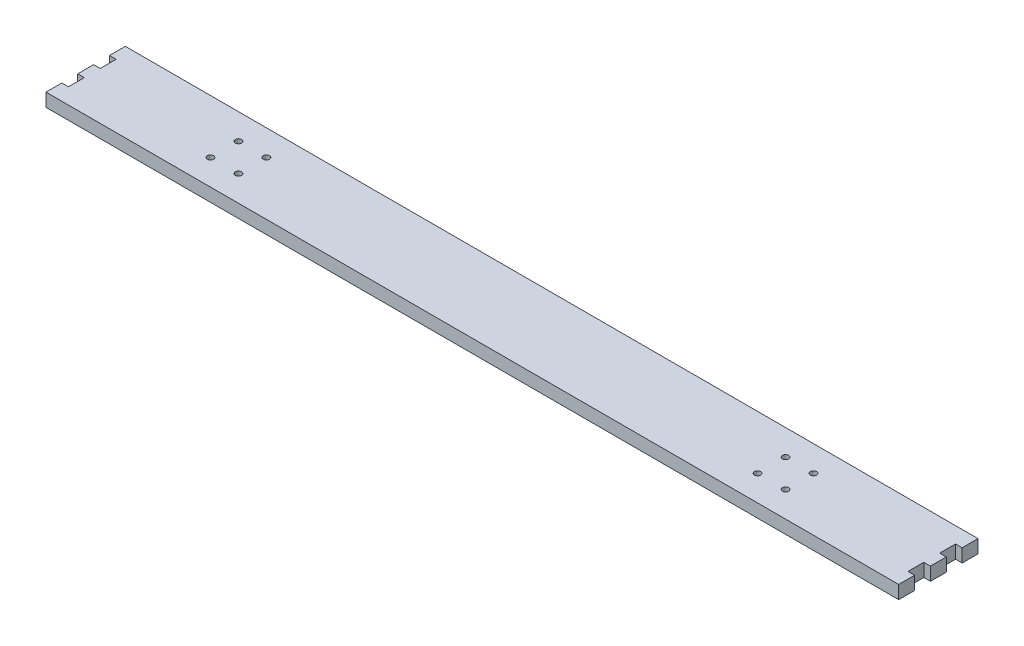
ISO-10303-21;
HEADER;
FILE_DESCRIPTION(('STEP AP214'),'2;1');
FILE_NAME('part.step','',(''),(''),'','','');
FILE_SCHEMA(('AUTOMOTIVE_DESIGN { 1 0 10303 214 1 1 1 1 }'));
ENDSEC;
DATA;
#1=APPLICATION_CONTEXT('core data for automotive mechanical design processes');
#2=APPLICATION_PROTOCOL_DEFINITION('international standard','automotive_design',2000,#1);
#3=PRODUCT_CONTEXT('',#1,'mechanical');
#4=PRODUCT('Part','Part','',(#3));
#5=PRODUCT_RELATED_PRODUCT_CATEGORY('part','',(#4));
#6=PRODUCT_DEFINITION_FORMATION('','',#4);
#7=PRODUCT_DEFINITION_CONTEXT('part definition',#1,'design');
#8=PRODUCT_DEFINITION('design','',#6,#7);
#9=PRODUCT_DEFINITION_SHAPE('','',#8);
#10=(LENGTH_UNIT() NAMED_UNIT(*) SI_UNIT(.MILLI.,.METRE.));
#11=(NAMED_UNIT(*) PLANE_ANGLE_UNIT() SI_UNIT($,.RADIAN.));
#12=(NAMED_UNIT(*) SI_UNIT($,.STERADIAN.) SOLID_ANGLE_UNIT());
#13=UNCERTAINTY_MEASURE_WITH_UNIT(LENGTH_MEASURE(1.E-05),#10,'distance_accuracy_value','');
#14=(GEOMETRIC_REPRESENTATION_CONTEXT(3) GLOBAL_UNCERTAINTY_ASSIGNED_CONTEXT((#13)) GLOBAL_UNIT_ASSIGNED_CONTEXT((#10,
#11,#12)) REPRESENTATION_CONTEXT('',''));
#15=CARTESIAN_POINT('',(0.,0.,0.));
#16=DIRECTION('',(0.,0.,1.));
#17=DIRECTION('',(1.,0.,0.));
#18=AXIS2_PLACEMENT_3D('',#15,#16,#17);
#19=CARTESIAN_POINT('',(204.7875,6.35,19.05));
#20=DIRECTION('',(-1.,0.,0.));
#21=DIRECTION('',(0.,0.,1.));
#22=AXIS2_PLACEMENT_3D('',#19,#20,#21);
#23=PLANE('',#22);
#24=DIRECTION('',(0.,1.,0.));
#25=VECTOR('',#24,1.);
#26=CARTESIAN_POINT('',(204.7875,-0.00100000000000013,-3.81));
#27=LINE('',#26,#25);
#28=CARTESIAN_POINT('',(204.7875,0.,-3.81));
#29=VERTEX_POINT('',#28);
#30=CARTESIAN_POINT('',(204.7875,6.35,-3.81));
#31=VERTEX_POINT('',#30);
#32=EDGE_CURVE('E178',#29,#31,#27,.T.);
#33=ORIENTED_EDGE('',*,*,#32,.T.);
#34=DIRECTION('',(0.,0.,-1.));
#35=VECTOR('',#34,1.);
#36=CARTESIAN_POINT('',(204.7875,6.35,19.05));
#37=LINE('',#36,#35);
#38=CARTESIAN_POINT('',(204.7875,6.35,3.81));
#39=VERTEX_POINT('',#38);
#40=EDGE_CURVE('E285',#39,#31,#37,.T.);
#41=ORIENTED_EDGE('',*,*,#40,.F.);
#42=DIRECTION('',(0.,1.,0.));
#43=VECTOR('',#42,1.);
#44=CARTESIAN_POINT('',(204.7875,-0.00100000000000013,3.81));
#45=LINE('',#44,#43);
#46=CARTESIAN_POINT('',(204.7875,0.,3.81));
#47=VERTEX_POINT('',#46);
#48=EDGE_CURVE('E304',#47,#39,#45,.T.);
#49=ORIENTED_EDGE('',*,*,#48,.F.);
#50=DIRECTION('',(0.,0.,-1.));
#51=VECTOR('',#50,1.);
#52=CARTESIAN_POINT('',(204.7875,0.,19.05));
#53=LINE('',#52,#51);
#54=EDGE_CURVE('E192',#47,#29,#53,.T.);
#55=ORIENTED_EDGE('',*,*,#54,.T.);
#56=EDGE_LOOP('',(#33,#41,#49,#55));
#57=FACE_BOUND('',#56,.T.);
#58=ADVANCED_FACE('F33',(#57),#23,.F.);
#59=DIRECTION('',(0.,1.,0.));
#60=VECTOR('',#59,1.);
#61=CARTESIAN_POINT('',(204.7875,-0.00100000000000013,-11.43));
#62=LINE('',#61,#60);
#63=CARTESIAN_POINT('',(204.7875,0.,-11.43));
#64=VERTEX_POINT('',#63);
#65=CARTESIAN_POINT('',(204.7875,6.35,-11.43));
#66=VERTEX_POINT('',#65);
#67=EDGE_CURVE('E172',#64,#66,#62,.T.);
#68=ORIENTED_EDGE('',*,*,#67,.F.);
#69=CARTESIAN_POINT('',(204.7875,0.,-19.05));
#70=VERTEX_POINT('',#69);
#71=EDGE_CURVE('E184',#64,#70,#53,.T.);
#72=ORIENTED_EDGE('',*,*,#71,.T.);
#73=DIRECTION('',(0.,-1.,0.));
#74=VECTOR('',#73,1.);
#75=CARTESIAN_POINT('',(204.7875,6.35,-19.05));
#76=LINE('',#75,#74);
#77=CARTESIAN_POINT('',(204.7875,6.35,-19.05));
#78=VERTEX_POINT('',#77);
#79=EDGE_CURVE('E11',#78,#70,#76,.T.);
#80=ORIENTED_EDGE('',*,*,#79,.F.);
#81=EDGE_CURVE('E186',#66,#78,#37,.T.);
#82=ORIENTED_EDGE('',*,*,#81,.F.);
#83=EDGE_LOOP('',(#68,#72,#80,#82));
#84=FACE_BOUND('',#83,.T.);
#85=ADVANCED_FACE('F182',(#84),#23,.F.);
#86=DIRECTION('',(0.,1.,0.));
#87=VECTOR('',#86,1.);
#88=CARTESIAN_POINT('',(204.7875,-0.00100000000000013,11.43));
#89=LINE('',#88,#87);
#90=CARTESIAN_POINT('',(204.7875,0.,11.43));
#91=VERTEX_POINT('',#90);
#92=CARTESIAN_POINT('',(204.7875,6.35,11.43));
#93=VERTEX_POINT('',#92);
#94=EDGE_CURVE('E303',#91,#93,#89,.T.);
#95=ORIENTED_EDGE('',*,*,#94,.T.);
#96=CARTESIAN_POINT('',(204.7875,6.35,19.05));
#97=VERTEX_POINT('',#96);
#98=EDGE_CURVE('E281',#97,#93,#37,.T.);
#99=ORIENTED_EDGE('',*,*,#98,.F.);
#100=DIRECTION('',(0.,-1.,0.));
#101=VECTOR('',#100,1.);
#102=CARTESIAN_POINT('',(204.7875,6.35,19.05));
#103=LINE('',#102,#101);
#104=CARTESIAN_POINT('',(204.7875,0.,19.05));
#105=VERTEX_POINT('',#104);
#106=EDGE_CURVE('E218',#97,#105,#103,.T.);
#107=ORIENTED_EDGE('',*,*,#106,.T.);
#108=EDGE_CURVE('E195',#105,#91,#53,.T.);
#109=ORIENTED_EDGE('',*,*,#108,.T.);
#110=EDGE_LOOP('',(#95,#99,#107,#109));
#111=FACE_BOUND('',#110,.T.);
#112=ADVANCED_FACE('F302',(#111),#23,.F.);
#113=CARTESIAN_POINT('',(0.,6.35,0.));
#114=DIRECTION('',(0.,-1.,0.));
#115=DIRECTION('',(0.,0.,-1.));
#116=AXIS2_PLACEMENT_3D('',#113,#114,#115);
#117=PLANE('',#116);
#118=CARTESIAN_POINT('',(138.1125,6.35,6.71751442127221));
#119=DIRECTION('',(0.,-1.,0.));
#120=DIRECTION('',(0.,0.,1.));
#121=AXIS2_PLACEMENT_3D('',#118,#119,#120);
#122=CIRCLE('',#121,1.5);
#123=CARTESIAN_POINT('',(138.1125,6.35,8.21751442127221));
#124=VERTEX_POINT('',#123);
#125=EDGE_CURVE('E589',#124,#124,#122,.T.);
#126=ORIENTED_EDGE('',*,*,#125,.T.);
#127=EDGE_LOOP('',(#126));
#128=FACE_BOUND('',#127,.T.);
#129=CARTESIAN_POINT('',(124.677471157456,6.35,-6.7175144212722));
#130=DIRECTION('',(0.,-1.,0.));
#131=DIRECTION('',(0.,0.,1.));
#132=AXIS2_PLACEMENT_3D('',#129,#130,#131);
#133=CIRCLE('',#132,1.5);
#134=CARTESIAN_POINT('',(124.677471157456,6.35,-5.21751442127221));
#135=VERTEX_POINT('',#134);
#136=EDGE_CURVE('E595',#135,#135,#133,.T.);
#137=ORIENTED_EDGE('',*,*,#136,.T.);
#138=EDGE_LOOP('',(#137));
#139=FACE_BOUND('',#138,.T.);
#140=CARTESIAN_POINT('',(124.677471157456,6.35,6.7175144212722));
#141=DIRECTION('',(0.,-1.,0.));
#142=DIRECTION('',(0.,0.,1.));
#143=AXIS2_PLACEMENT_3D('',#140,#141,#142);
#144=CIRCLE('',#143,1.5);
#145=CARTESIAN_POINT('',(124.677471157456,6.35,8.2175144212722));
#146=VERTEX_POINT('',#145);
#147=EDGE_CURVE('E654',#146,#146,#144,.T.);
#148=ORIENTED_EDGE('',*,*,#147,.T.);
#149=EDGE_LOOP('',(#148));
#150=FACE_BOUND('',#149,.T.);
#151=CARTESIAN_POINT('',(138.1125,6.35,-6.71751442127219));
#152=DIRECTION('',(0.,-1.,0.));
#153=DIRECTION('',(0.,0.,1.));
#154=AXIS2_PLACEMENT_3D('',#151,#152,#153);
#155=CIRCLE('',#154,1.5);
#156=CARTESIAN_POINT('',(138.1125,6.35,-5.2175144212722));
#157=VERTEX_POINT('',#156);
#158=EDGE_CURVE('E592',#157,#157,#155,.T.);
#159=ORIENTED_EDGE('',*,*,#158,.T.);
#160=EDGE_LOOP('',(#159));
#161=FACE_BOUND('',#160,.T.);
#162=CARTESIAN_POINT('',(-138.1125,6.35,6.71751442127221));
#163=DIRECTION('',(0.,1.,0.));
#164=DIRECTION('',(0.,0.,1.));
#165=AXIS2_PLACEMENT_3D('',#162,#163,#164);
#166=CIRCLE('',#165,1.5);
#167=CARTESIAN_POINT('',(-138.1125,6.35,8.21751442127221));
#168=VERTEX_POINT('',#167);
#169=EDGE_CURVE('E615',#168,#168,#166,.T.);
#170=ORIENTED_EDGE('',*,*,#169,.F.);
#171=EDGE_LOOP('',(#170));
#172=FACE_BOUND('',#171,.T.);
#173=CARTESIAN_POINT('',(-124.677471157456,6.35,-6.7175144212722));
#174=DIRECTION('',(0.,1.,0.));
#175=DIRECTION('',(0.,0.,1.));
#176=AXIS2_PLACEMENT_3D('',#173,#174,#175);
#177=CIRCLE('',#176,1.5);
#178=CARTESIAN_POINT('',(-124.677471157456,6.35,-5.21751442127221));
#179=VERTEX_POINT('',#178);
#180=EDGE_CURVE('E621',#179,#179,#177,.T.);
#181=ORIENTED_EDGE('',*,*,#180,.F.);
#182=EDGE_LOOP('',(#181));
#183=FACE_BOUND('',#182,.T.);
#184=CARTESIAN_POINT('',(-124.677471157456,6.35,6.7175144212722));
#185=DIRECTION('',(0.,1.,0.));
#186=DIRECTION('',(0.,0.,1.));
#187=AXIS2_PLACEMENT_3D('',#184,#185,#186);
#188=CIRCLE('',#187,1.5);
#189=CARTESIAN_POINT('',(-124.677471157456,6.35,8.2175144212722));
#190=VERTEX_POINT('',#189);
#191=EDGE_CURVE('E609',#190,#190,#188,.T.);
#192=ORIENTED_EDGE('',*,*,#191,.F.);
#193=EDGE_LOOP('',(#192));
#194=FACE_BOUND('',#193,.T.);
#195=CARTESIAN_POINT('',(-138.1125,6.35,-6.71751442127219));
#196=DIRECTION('',(0.,1.,0.));
#197=DIRECTION('',(0.,0.,1.));
#198=AXIS2_PLACEMENT_3D('',#195,#196,#197);
#199=CIRCLE('',#198,1.5);
#200=CARTESIAN_POINT('',(-138.1125,6.35,-5.2175144212722));
#201=VERTEX_POINT('',#200);
#202=EDGE_CURVE('E339',#201,#201,#199,.T.);
#203=ORIENTED_EDGE('',*,*,#202,.F.);
#204=EDGE_LOOP('',(#203));
#205=FACE_BOUND('',#204,.T.);
#206=DIRECTION('',(-1.,0.,0.));
#207=VECTOR('',#206,1.);
#208=CARTESIAN_POINT('',(204.7875,6.35,-3.81));
#209=LINE('',#208,#207);
#210=CARTESIAN_POINT('',(201.6125,6.35,-3.81));
#211=VERTEX_POINT('',#210);
#212=EDGE_CURVE('E187',#31,#211,#209,.T.);
#213=ORIENTED_EDGE('',*,*,#212,.T.);
#214=DIRECTION('',(0.,0.,-1.));
#215=VECTOR('',#214,1.);
#216=CARTESIAN_POINT('',(201.6125,6.35,-11.43));
#217=LINE('',#216,#215);
#218=CARTESIAN_POINT('',(201.6125,6.35,-11.43));
#219=VERTEX_POINT('',#218);
#220=EDGE_CURVE('E328',#211,#219,#217,.T.);
#221=ORIENTED_EDGE('',*,*,#220,.T.);
#222=DIRECTION('',(1.,0.,0.));
#223=VECTOR('',#222,1.);
#224=CARTESIAN_POINT('',(204.7875,6.35,-11.43));
#225=LINE('',#224,#223);
#226=EDGE_CURVE('E321',#219,#66,#225,.T.);
#227=ORIENTED_EDGE('',*,*,#226,.T.);
#228=ORIENTED_EDGE('',*,*,#81,.T.);
#229=DIRECTION('',(-1.,0.,0.));
#230=VECTOR('',#229,1.);
#231=CARTESIAN_POINT('',(-204.7875,6.35,-19.05));
#232=LINE('',#231,#230);
#233=CARTESIAN_POINT('',(-204.7875,6.35,-19.05));
#234=VERTEX_POINT('',#233);
#235=EDGE_CURVE('E284',#78,#234,#232,.T.);
#236=ORIENTED_EDGE('',*,*,#235,.T.);
#237=DIRECTION('',(0.,0.,1.));
#238=VECTOR('',#237,1.);
#239=CARTESIAN_POINT('',(-204.7875,6.35,19.05));
#240=LINE('',#239,#238);
#241=CARTESIAN_POINT('',(-204.7875,6.35,-11.43));
#242=VERTEX_POINT('',#241);
#243=EDGE_CURVE('E228',#234,#242,#240,.T.);
#244=ORIENTED_EDGE('',*,*,#243,.T.);
#245=DIRECTION('',(-1.,0.,0.));
#246=VECTOR('',#245,1.);
#247=CARTESIAN_POINT('',(-204.7875,6.35,-11.43));
#248=LINE('',#247,#246);
#249=CARTESIAN_POINT('',(-201.6125,6.35,-11.43));
#250=VERTEX_POINT('',#249);
#251=EDGE_CURVE('E248',#250,#242,#248,.T.);
#252=ORIENTED_EDGE('',*,*,#251,.F.);
#253=DIRECTION('',(0.,0.,-1.));
#254=VECTOR('',#253,1.);
#255=CARTESIAN_POINT('',(-201.6125,6.35,-11.43));
#256=LINE('',#255,#254);
#257=CARTESIAN_POINT('',(-201.6125,6.35,-3.81));
#258=VERTEX_POINT('',#257);
#259=EDGE_CURVE('E240',#258,#250,#256,.T.);
#260=ORIENTED_EDGE('',*,*,#259,.F.);
#261=DIRECTION('',(1.,0.,0.));
#262=VECTOR('',#261,1.);
#263=CARTESIAN_POINT('',(-204.7875,6.35,-3.81));
#264=LINE('',#263,#262);
#265=CARTESIAN_POINT('',(-204.7875,6.35,-3.81));
#266=VERTEX_POINT('',#265);
#267=EDGE_CURVE('E237',#266,#258,#264,.T.);
#268=ORIENTED_EDGE('',*,*,#267,.F.);
#269=CARTESIAN_POINT('',(-204.7875,6.35,3.81));
#270=VERTEX_POINT('',#269);
#271=EDGE_CURVE('E288',#266,#270,#240,.T.);
#272=ORIENTED_EDGE('',*,*,#271,.T.);
#273=DIRECTION('',(-1.,0.,0.));
#274=VECTOR('',#273,1.);
#275=CARTESIAN_POINT('',(-204.7875,6.35,3.81));
#276=LINE('',#275,#274);
#277=CARTESIAN_POINT('',(-201.6125,6.35,3.81));
#278=VERTEX_POINT('',#277);
#279=EDGE_CURVE('E265',#278,#270,#276,.T.);
#280=ORIENTED_EDGE('',*,*,#279,.F.);
#281=DIRECTION('',(0.,0.,-1.));
#282=VECTOR('',#281,1.);
#283=CARTESIAN_POINT('',(-201.6125,6.35,3.81));
#284=LINE('',#283,#282);
#285=CARTESIAN_POINT('',(-201.6125,6.35,11.43));
#286=VERTEX_POINT('',#285);
#287=EDGE_CURVE('E270',#286,#278,#284,.T.);
#288=ORIENTED_EDGE('',*,*,#287,.F.);
#289=DIRECTION('',(1.,0.,0.));
#290=VECTOR('',#289,1.);
#291=CARTESIAN_POINT('',(-204.7875,6.35,11.43));
#292=LINE('',#291,#290);
#293=CARTESIAN_POINT('',(-204.7875,6.35,11.43));
#294=VERTEX_POINT('',#293);
#295=EDGE_CURVE('E267',#294,#286,#292,.T.);
#296=ORIENTED_EDGE('',*,*,#295,.F.);
#297=CARTESIAN_POINT('',(-204.7875,6.35,19.05));
#298=VERTEX_POINT('',#297);
#299=EDGE_CURVE('E287',#294,#298,#240,.T.);
#300=ORIENTED_EDGE('',*,*,#299,.T.);
#301=DIRECTION('',(1.,0.,0.));
#302=VECTOR('',#301,1.);
#303=CARTESIAN_POINT('',(-204.7875,6.35,19.05));
#304=LINE('',#303,#302);
#305=EDGE_CURVE('E221',#298,#97,#304,.T.);
#306=ORIENTED_EDGE('',*,*,#305,.T.);
#307=ORIENTED_EDGE('',*,*,#98,.T.);
#308=DIRECTION('',(-1.,0.,0.));
#309=VECTOR('',#308,1.);
#310=CARTESIAN_POINT('',(204.7875,6.35,11.43));
#311=LINE('',#310,#309);
#312=CARTESIAN_POINT('',(201.6125,6.35,11.43));
#313=VERTEX_POINT('',#312);
#314=EDGE_CURVE('E313',#93,#313,#311,.T.);
#315=ORIENTED_EDGE('',*,*,#314,.T.);
#316=DIRECTION('',(0.,0.,-1.));
#317=VECTOR('',#316,1.);
#318=CARTESIAN_POINT('',(201.6125,6.35,3.81));
#319=LINE('',#318,#317);
#320=CARTESIAN_POINT('',(201.6125,6.35,3.81));
#321=VERTEX_POINT('',#320);
#322=EDGE_CURVE('E344',#313,#321,#319,.T.);
#323=ORIENTED_EDGE('',*,*,#322,.T.);
#324=DIRECTION('',(1.,0.,0.));
#325=VECTOR('',#324,1.);
#326=CARTESIAN_POINT('',(204.7875,6.35,3.81));
#327=LINE('',#326,#325);
#328=EDGE_CURVE('E341',#321,#39,#327,.T.);
#329=ORIENTED_EDGE('',*,*,#328,.T.);
#330=ORIENTED_EDGE('',*,*,#40,.T.);
#331=EDGE_LOOP('',(#213,#221,#227,#228,#236,#244,#252,#260,#268,#272,#280,#288,#296,#300,#306,
#307,#315,#323,#329,#330));
#332=FACE_BOUND('',#331,.T.);
#333=ADVANCED_FACE('F293',(#128,#139,#150,#161,#172,#183,#194,#205,#332),#117,.F.);
#334=CARTESIAN_POINT('',(0.,0.,0.));
#335=DIRECTION('',(0.,-1.,0.));
#336=DIRECTION('',(0.,0.,-1.));
#337=AXIS2_PLACEMENT_3D('',#334,#335,#336);
#338=PLANE('',#337);
#339=CARTESIAN_POINT('',(138.1125,0.,6.71751442127221));
#340=DIRECTION('',(0.,-1.,0.));
#341=DIRECTION('',(0.,0.,-1.));
#342=AXIS2_PLACEMENT_3D('',#339,#340,#341);
#343=CIRCLE('',#342,1.5);
#344=CARTESIAN_POINT('',(138.1125,0.,5.21751442127221));
#345=VERTEX_POINT('',#344);
#346=EDGE_CURVE('E587',#345,#345,#343,.T.);
#347=ORIENTED_EDGE('',*,*,#346,.F.);
#348=EDGE_LOOP('',(#347));
#349=FACE_BOUND('',#348,.T.);
#350=CARTESIAN_POINT('',(124.677471157456,0.,-6.7175144212722));
#351=DIRECTION('',(0.,-1.,0.));
#352=DIRECTION('',(0.,0.,-1.));
#353=AXIS2_PLACEMENT_3D('',#350,#351,#352);
#354=CIRCLE('',#353,1.5);
#355=CARTESIAN_POINT('',(124.677471157456,0.,-8.2175144212722));
#356=VERTEX_POINT('',#355);
#357=EDGE_CURVE('E590',#356,#356,#354,.T.);
#358=ORIENTED_EDGE('',*,*,#357,.F.);
#359=EDGE_LOOP('',(#358));
#360=FACE_BOUND('',#359,.T.);
#361=CARTESIAN_POINT('',(124.677471157456,0.,6.7175144212722));
#362=DIRECTION('',(0.,-1.,0.));
#363=DIRECTION('',(0.,0.,-1.));
#364=AXIS2_PLACEMENT_3D('',#361,#362,#363);
#365=CIRCLE('',#364,1.5);
#366=CARTESIAN_POINT('',(124.677471157456,0.,5.21751442127221));
#367=VERTEX_POINT('',#366);
#368=EDGE_CURVE('E598',#367,#367,#365,.T.);
#369=ORIENTED_EDGE('',*,*,#368,.F.);
#370=EDGE_LOOP('',(#369));
#371=FACE_BOUND('',#370,.T.);
#372=CARTESIAN_POINT('',(138.1125,0.,-6.71751442127219));
#373=DIRECTION('',(0.,-1.,0.));
#374=DIRECTION('',(0.,0.,-1.));
#375=AXIS2_PLACEMENT_3D('',#372,#373,#374);
#376=CIRCLE('',#375,1.5);
#377=CARTESIAN_POINT('',(138.1125,0.,-8.21751442127219));
#378=VERTEX_POINT('',#377);
#379=EDGE_CURVE('E605',#378,#378,#376,.T.);
#380=ORIENTED_EDGE('',*,*,#379,.F.);
#381=EDGE_LOOP('',(#380));
#382=FACE_BOUND('',#381,.T.);
#383=CARTESIAN_POINT('',(-138.1125,0.,6.71751442127221));
#384=DIRECTION('',(0.,-1.,0.));
#385=DIRECTION('',(0.,0.,-1.));
#386=AXIS2_PLACEMENT_3D('',#383,#384,#385);
#387=CIRCLE('',#386,1.5);
#388=CARTESIAN_POINT('',(-138.1125,0.,5.21751442127221));
#389=VERTEX_POINT('',#388);
#390=EDGE_CURVE('E618',#389,#389,#387,.F.);
#391=ORIENTED_EDGE('',*,*,#390,.T.);
#392=EDGE_LOOP('',(#391));
#393=FACE_BOUND('',#392,.T.);
#394=CARTESIAN_POINT('',(-124.677471157456,0.,-6.7175144212722));
#395=DIRECTION('',(0.,-1.,0.));
#396=DIRECTION('',(0.,0.,-1.));
#397=AXIS2_PLACEMENT_3D('',#394,#395,#396);
#398=CIRCLE('',#397,1.5);
#399=CARTESIAN_POINT('',(-124.677471157456,0.,-8.2175144212722));
#400=VERTEX_POINT('',#399);
#401=EDGE_CURVE('E612',#400,#400,#398,.F.);
#402=ORIENTED_EDGE('',*,*,#401,.T.);
#403=EDGE_LOOP('',(#402));
#404=FACE_BOUND('',#403,.T.);
#405=CARTESIAN_POINT('',(-124.677471157456,0.,6.7175144212722));
#406=DIRECTION('',(0.,-1.,0.));
#407=DIRECTION('',(0.,0.,-1.));
#408=AXIS2_PLACEMENT_3D('',#405,#406,#407);
#409=CIRCLE('',#408,1.5);
#410=CARTESIAN_POINT('',(-124.677471157456,0.,5.21751442127221));
#411=VERTEX_POINT('',#410);
#412=EDGE_CURVE('E608',#411,#411,#409,.F.);
#413=ORIENTED_EDGE('',*,*,#412,.T.);
#414=EDGE_LOOP('',(#413));
#415=FACE_BOUND('',#414,.T.);
#416=CARTESIAN_POINT('',(-138.1125,0.,-6.71751442127219));
#417=DIRECTION('',(0.,-1.,0.));
#418=DIRECTION('',(0.,0.,-1.));
#419=AXIS2_PLACEMENT_3D('',#416,#417,#418);
#420=CIRCLE('',#419,1.5);
#421=CARTESIAN_POINT('',(-138.1125,0.,-8.21751442127219));
#422=VERTEX_POINT('',#421);
#423=EDGE_CURVE('E324',#422,#422,#420,.F.);
#424=ORIENTED_EDGE('',*,*,#423,.T.);
#425=EDGE_LOOP('',(#424));
#426=FACE_BOUND('',#425,.T.);
#427=DIRECTION('',(0.,0.,-1.));
#428=VECTOR('',#427,1.);
#429=CARTESIAN_POINT('',(201.6125,0.,-11.43));
#430=LINE('',#429,#428);
#431=CARTESIAN_POINT('',(201.6125,0.,-3.81));
#432=VERTEX_POINT('',#431);
#433=CARTESIAN_POINT('',(201.6125,0.,-11.43));
#434=VERTEX_POINT('',#433);
#435=EDGE_CURVE('E47',#432,#434,#430,.T.);
#436=ORIENTED_EDGE('',*,*,#435,.F.);
#437=DIRECTION('',(-1.,0.,0.));
#438=VECTOR('',#437,1.);
#439=CARTESIAN_POINT('',(204.7875,0.,-3.81));
#440=LINE('',#439,#438);
#441=EDGE_CURVE('E318',#29,#432,#440,.T.);
#442=ORIENTED_EDGE('',*,*,#441,.F.);
#443=ORIENTED_EDGE('',*,*,#54,.F.);
#444=DIRECTION('',(1.,0.,0.));
#445=VECTOR('',#444,1.);
#446=CARTESIAN_POINT('',(204.7875,0.,3.81));
#447=LINE('',#446,#445);
#448=CARTESIAN_POINT('',(201.6125,0.,3.81));
#449=VERTEX_POINT('',#448);
#450=EDGE_CURVE('E338',#449,#47,#447,.T.);
#451=ORIENTED_EDGE('',*,*,#450,.F.);
#452=DIRECTION('',(0.,0.,-1.));
#453=VECTOR('',#452,1.);
#454=CARTESIAN_POINT('',(201.6125,0.,3.81));
#455=LINE('',#454,#453);
#456=CARTESIAN_POINT('',(201.6125,0.,11.43));
#457=VERTEX_POINT('',#456);
#458=EDGE_CURVE('E307',#457,#449,#455,.T.);
#459=ORIENTED_EDGE('',*,*,#458,.F.);
#460=DIRECTION('',(-1.,0.,0.));
#461=VECTOR('',#460,1.);
#462=CARTESIAN_POINT('',(204.7875,0.,11.43));
#463=LINE('',#462,#461);
#464=EDGE_CURVE('E55',#91,#457,#463,.T.);
#465=ORIENTED_EDGE('',*,*,#464,.F.);
#466=ORIENTED_EDGE('',*,*,#108,.F.);
#467=DIRECTION('',(1.,0.,0.));
#468=VECTOR('',#467,1.);
#469=CARTESIAN_POINT('',(-204.7875,0.,19.05));
#470=LINE('',#469,#468);
#471=CARTESIAN_POINT('',(-204.7875,0.,19.05));
#472=VERTEX_POINT('',#471);
#473=EDGE_CURVE('E216',#472,#105,#470,.T.);
#474=ORIENTED_EDGE('',*,*,#473,.F.);
#475=DIRECTION('',(0.,0.,1.));
#476=VECTOR('',#475,1.);
#477=CARTESIAN_POINT('',(-204.7875,0.,19.05));
#478=LINE('',#477,#476);
#479=CARTESIAN_POINT('',(-204.7875,0.,11.43));
#480=VERTEX_POINT('',#479);
#481=EDGE_CURVE('E207',#480,#472,#478,.T.);
#482=ORIENTED_EDGE('',*,*,#481,.F.);
#483=DIRECTION('',(1.,0.,0.));
#484=VECTOR('',#483,1.);
#485=CARTESIAN_POINT('',(-204.7875,0.,11.43));
#486=LINE('',#485,#484);
#487=CARTESIAN_POINT('',(-201.6125,0.,11.43));
#488=VERTEX_POINT('',#487);
#489=EDGE_CURVE('E177',#480,#488,#486,.T.);
#490=ORIENTED_EDGE('',*,*,#489,.T.);
#491=DIRECTION('',(0.,0.,-1.));
#492=VECTOR('',#491,1.);
#493=CARTESIAN_POINT('',(-201.6125,0.,3.81));
#494=LINE('',#493,#492);
#495=CARTESIAN_POINT('',(-201.6125,0.,3.81));
#496=VERTEX_POINT('',#495);
#497=EDGE_CURVE('E259',#488,#496,#494,.T.);
#498=ORIENTED_EDGE('',*,*,#497,.T.);
#499=DIRECTION('',(-1.,0.,0.));
#500=VECTOR('',#499,1.);
#501=CARTESIAN_POINT('',(-204.7875,0.,3.81));
#502=LINE('',#501,#500);
#503=CARTESIAN_POINT('',(-204.7875,0.,3.81));
#504=VERTEX_POINT('',#503);
#505=EDGE_CURVE('E262',#496,#504,#502,.T.);
#506=ORIENTED_EDGE('',*,*,#505,.T.);
#507=CARTESIAN_POINT('',(-204.7875,0.,-3.80999999999999));
#508=VERTEX_POINT('',#507);
#509=EDGE_CURVE('E211',#508,#504,#478,.T.);
#510=ORIENTED_EDGE('',*,*,#509,.F.);
#511=DIRECTION('',(1.,0.,0.));
#512=VECTOR('',#511,1.);
#513=CARTESIAN_POINT('',(-204.7875,0.,-3.81));
#514=LINE('',#513,#512);
#515=CARTESIAN_POINT('',(-201.6125,0.,-3.81));
#516=VERTEX_POINT('',#515);
#517=EDGE_CURVE('E193',#508,#516,#514,.T.);
#518=ORIENTED_EDGE('',*,*,#517,.T.);
#519=DIRECTION('',(0.,0.,-1.));
#520=VECTOR('',#519,1.);
#521=CARTESIAN_POINT('',(-201.6125,0.,-11.43));
#522=LINE('',#521,#520);
#523=CARTESIAN_POINT('',(-201.6125,0.,-11.43));
#524=VERTEX_POINT('',#523);
#525=EDGE_CURVE('E234',#516,#524,#522,.T.);
#526=ORIENTED_EDGE('',*,*,#525,.T.);
#527=DIRECTION('',(-1.,0.,0.));
#528=VECTOR('',#527,1.);
#529=CARTESIAN_POINT('',(-204.7875,0.,-11.43));
#530=LINE('',#529,#528);
#531=CARTESIAN_POINT('',(-204.7875,0.,-11.43));
#532=VERTEX_POINT('',#531);
#533=EDGE_CURVE('E232',#524,#532,#530,.T.);
#534=ORIENTED_EDGE('',*,*,#533,.T.);
#535=CARTESIAN_POINT('',(-204.7875,0.,-19.05));
#536=VERTEX_POINT('',#535);
#537=EDGE_CURVE('E213',#536,#532,#478,.T.);
#538=ORIENTED_EDGE('',*,*,#537,.F.);
#539=DIRECTION('',(-1.,0.,0.));
#540=VECTOR('',#539,1.);
#541=CARTESIAN_POINT('',(-204.7875,0.,-19.05));
#542=LINE('',#541,#540);
#543=EDGE_CURVE('E191',#70,#536,#542,.T.);
#544=ORIENTED_EDGE('',*,*,#543,.F.);
#545=ORIENTED_EDGE('',*,*,#71,.F.);
#546=DIRECTION('',(1.,0.,0.));
#547=VECTOR('',#546,1.);
#548=CARTESIAN_POINT('',(204.7875,0.,-11.43));
#549=LINE('',#548,#547);
#550=EDGE_CURVE('E168',#434,#64,#549,.T.);
#551=ORIENTED_EDGE('',*,*,#550,.F.);
#552=EDGE_LOOP('',(#436,#442,#443,#451,#459,#465,#466,#474,#482,#490,#498,#506,#510,#518,#526,
#534,#538,#544,#545,#551));
#553=FACE_BOUND('',#552,.T.);
#554=ADVANCED_FACE('F189',(#349,#360,#371,#382,#393,#404,#415,#426,#553),#338,.T.);
#555=CARTESIAN_POINT('',(-204.7875,6.35,19.05));
#556=DIRECTION('',(1.,0.,0.));
#557=DIRECTION('',(0.,0.,-1.));
#558=AXIS2_PLACEMENT_3D('',#555,#556,#557);
#559=PLANE('',#558);
#560=ORIENTED_EDGE('',*,*,#537,.T.);
#561=DIRECTION('',(0.,1.,0.));
#562=VECTOR('',#561,1.);
#563=CARTESIAN_POINT('',(-204.7875,-0.00100000000000013,-11.43));
#564=LINE('',#563,#562);
#565=EDGE_CURVE('E198',#532,#242,#564,.T.);
#566=ORIENTED_EDGE('',*,*,#565,.T.);
#567=ORIENTED_EDGE('',*,*,#243,.F.);
#568=DIRECTION('',(0.,-1.,0.));
#569=VECTOR('',#568,1.);
#570=CARTESIAN_POINT('',(-204.7875,6.35,-19.05));
#571=LINE('',#570,#569);
#572=EDGE_CURVE('E40',#234,#536,#571,.T.);
#573=ORIENTED_EDGE('',*,*,#572,.T.);
#574=EDGE_LOOP('',(#560,#566,#567,#573));
#575=FACE_BOUND('',#574,.T.);
#576=ADVANCED_FACE('F225',(#575),#559,.F.);
#577=ORIENTED_EDGE('',*,*,#271,.F.);
#578=DIRECTION('',(0.,1.,0.));
#579=VECTOR('',#578,1.);
#580=CARTESIAN_POINT('',(-204.7875,-0.00100000000000013,-3.81));
#581=LINE('',#580,#579);
#582=EDGE_CURVE('E250',#508,#266,#581,.T.);
#583=ORIENTED_EDGE('',*,*,#582,.F.);
#584=ORIENTED_EDGE('',*,*,#509,.T.);
#585=DIRECTION('',(0.,1.,0.));
#586=VECTOR('',#585,1.);
#587=CARTESIAN_POINT('',(-204.7875,-0.00100000000000013,3.81));
#588=LINE('',#587,#586);
#589=EDGE_CURVE('E273',#504,#270,#588,.T.);
#590=ORIENTED_EDGE('',*,*,#589,.T.);
#591=EDGE_LOOP('',(#577,#583,#584,#590));
#592=FACE_BOUND('',#591,.T.);
#593=ADVANCED_FACE('F360',(#592),#559,.F.);
#594=CARTESIAN_POINT('',(-204.7875,6.35,-19.05));
#595=DIRECTION('',(0.,0.,1.));
#596=DIRECTION('',(1.,0.,0.));
#597=AXIS2_PLACEMENT_3D('',#594,#595,#596);
#598=PLANE('',#597);
#599=ORIENTED_EDGE('',*,*,#543,.T.);
#600=ORIENTED_EDGE('',*,*,#572,.F.);
#601=ORIENTED_EDGE('',*,*,#235,.F.);
#602=ORIENTED_EDGE('',*,*,#79,.T.);
#603=EDGE_LOOP('',(#599,#600,#601,#602));
#604=FACE_BOUND('',#603,.T.);
#605=ADVANCED_FACE('F357',(#604),#598,.F.);
#606=ORIENTED_EDGE('',*,*,#299,.F.);
#607=DIRECTION('',(0.,1.,0.));
#608=VECTOR('',#607,1.);
#609=CARTESIAN_POINT('',(-204.7875,-0.00100000000000013,11.43));
#610=LINE('',#609,#608);
#611=EDGE_CURVE('E277',#480,#294,#610,.T.);
#612=ORIENTED_EDGE('',*,*,#611,.F.);
#613=ORIENTED_EDGE('',*,*,#481,.T.);
#614=DIRECTION('',(0.,-1.,0.));
#615=VECTOR('',#614,1.);
#616=CARTESIAN_POINT('',(-204.7875,6.35,19.05));
#617=LINE('',#616,#615);
#618=EDGE_CURVE('E220',#298,#472,#617,.T.);
#619=ORIENTED_EDGE('',*,*,#618,.F.);
#620=EDGE_LOOP('',(#606,#612,#613,#619));
#621=FACE_BOUND('',#620,.T.);
#622=ADVANCED_FACE('F359',(#621),#559,.F.);
#623=CARTESIAN_POINT('',(-204.7875,6.35,19.05));
#624=DIRECTION('',(0.,0.,-1.));
#625=DIRECTION('',(-1.,0.,0.));
#626=AXIS2_PLACEMENT_3D('',#623,#624,#625);
#627=PLANE('',#626);
#628=ORIENTED_EDGE('',*,*,#473,.T.);
#629=ORIENTED_EDGE('',*,*,#106,.F.);
#630=ORIENTED_EDGE('',*,*,#305,.F.);
#631=ORIENTED_EDGE('',*,*,#618,.T.);
#632=EDGE_LOOP('',(#628,#629,#630,#631));
#633=FACE_BOUND('',#632,.T.);
#634=ADVANCED_FACE('F300',(#633),#627,.F.);
#635=CARTESIAN_POINT('',(-204.7875,-0.00100000000000013,3.81));
#636=DIRECTION('',(0.,0.,-1.));
#637=DIRECTION('',(-1.,0.,0.));
#638=AXIS2_PLACEMENT_3D('',#635,#636,#637);
#639=PLANE('',#638);
#640=DIRECTION('',(0.,1.,0.));
#641=VECTOR('',#640,1.);
#642=CARTESIAN_POINT('',(-201.6125,-0.00100000000000013,3.81));
#643=LINE('',#642,#641);
#644=EDGE_CURVE('E242',#496,#278,#643,.T.);
#645=ORIENTED_EDGE('',*,*,#644,.T.);
#646=ORIENTED_EDGE('',*,*,#279,.T.);
#647=ORIENTED_EDGE('',*,*,#589,.F.);
#648=ORIENTED_EDGE('',*,*,#505,.F.);
#649=EDGE_LOOP('',(#645,#646,#647,#648));
#650=FACE_BOUND('',#649,.T.);
#651=ADVANCED_FACE('F386',(#650),#639,.F.);
#652=CARTESIAN_POINT('',(-201.6125,-0.00100000000000013,3.81));
#653=DIRECTION('',(1.,0.,0.));
#654=DIRECTION('',(0.,0.,-1.));
#655=AXIS2_PLACEMENT_3D('',#652,#653,#654);
#656=PLANE('',#655);
#657=DIRECTION('',(0.,1.,0.));
#658=VECTOR('',#657,1.);
#659=CARTESIAN_POINT('',(-201.6125,-0.00100000000000013,11.43));
#660=LINE('',#659,#658);
#661=EDGE_CURVE('E275',#488,#286,#660,.T.);
#662=ORIENTED_EDGE('',*,*,#661,.T.);
#663=ORIENTED_EDGE('',*,*,#287,.T.);
#664=ORIENTED_EDGE('',*,*,#644,.F.);
#665=ORIENTED_EDGE('',*,*,#497,.F.);
#666=EDGE_LOOP('',(#662,#663,#664,#665));
#667=FACE_BOUND('',#666,.T.);
#668=ADVANCED_FACE('F393',(#667),#656,.F.);
#669=CARTESIAN_POINT('',(-204.7875,-0.00100000000000013,11.43));
#670=DIRECTION('',(0.,0.,1.));
#671=DIRECTION('',(1.,0.,0.));
#672=AXIS2_PLACEMENT_3D('',#669,#670,#671);
#673=PLANE('',#672);
#674=ORIENTED_EDGE('',*,*,#611,.T.);
#675=ORIENTED_EDGE('',*,*,#295,.T.);
#676=ORIENTED_EDGE('',*,*,#661,.F.);
#677=ORIENTED_EDGE('',*,*,#489,.F.);
#678=EDGE_LOOP('',(#674,#675,#676,#677));
#679=FACE_BOUND('',#678,.T.);
#680=ADVANCED_FACE('F398',(#679),#673,.F.);
#681=CARTESIAN_POINT('',(-204.7875,-0.00100000000000013,-11.43));
#682=DIRECTION('',(0.,0.,-1.));
#683=DIRECTION('',(-1.,0.,0.));
#684=AXIS2_PLACEMENT_3D('',#681,#682,#683);
#685=PLANE('',#684);
#686=DIRECTION('',(0.,1.,0.));
#687=VECTOR('',#686,1.);
#688=CARTESIAN_POINT('',(-201.6125,-0.00100000000000013,-11.43));
#689=LINE('',#688,#687);
#690=EDGE_CURVE('E252',#524,#250,#689,.T.);
#691=ORIENTED_EDGE('',*,*,#690,.T.);
#692=ORIENTED_EDGE('',*,*,#251,.T.);
#693=ORIENTED_EDGE('',*,*,#565,.F.);
#694=ORIENTED_EDGE('',*,*,#533,.F.);
#695=EDGE_LOOP('',(#691,#692,#693,#694));
#696=FACE_BOUND('',#695,.T.);
#697=ADVANCED_FACE('F438',(#696),#685,.F.);
#698=CARTESIAN_POINT('',(-201.6125,-0.00100000000000013,-11.43));
#699=DIRECTION('',(1.,0.,0.));
#700=DIRECTION('',(0.,0.,-1.));
#701=AXIS2_PLACEMENT_3D('',#698,#699,#700);
#702=PLANE('',#701);
#703=DIRECTION('',(0.,1.,0.));
#704=VECTOR('',#703,1.);
#705=CARTESIAN_POINT('',(-201.6125,-0.00100000000000013,-3.81));
#706=LINE('',#705,#704);
#707=EDGE_CURVE('E254',#516,#258,#706,.T.);
#708=ORIENTED_EDGE('',*,*,#707,.T.);
#709=ORIENTED_EDGE('',*,*,#259,.T.);
#710=ORIENTED_EDGE('',*,*,#690,.F.);
#711=ORIENTED_EDGE('',*,*,#525,.F.);
#712=EDGE_LOOP('',(#708,#709,#710,#711));
#713=FACE_BOUND('',#712,.T.);
#714=ADVANCED_FACE('F441',(#713),#702,.F.);
#715=CARTESIAN_POINT('',(-204.7875,-0.00100000000000013,-3.81));
#716=DIRECTION('',(0.,0.,1.));
#717=DIRECTION('',(1.,0.,0.));
#718=AXIS2_PLACEMENT_3D('',#715,#716,#717);
#719=PLANE('',#718);
#720=ORIENTED_EDGE('',*,*,#582,.T.);
#721=ORIENTED_EDGE('',*,*,#267,.T.);
#722=ORIENTED_EDGE('',*,*,#707,.F.);
#723=ORIENTED_EDGE('',*,*,#517,.F.);
#724=EDGE_LOOP('',(#720,#721,#722,#723));
#725=FACE_BOUND('',#724,.T.);
#726=ADVANCED_FACE('F437',(#725),#719,.F.);
#727=CARTESIAN_POINT('',(204.7875,-0.00100000000000013,3.81));
#728=DIRECTION('',(0.,0.,1.));
#729=DIRECTION('',(1.,0.,0.));
#730=AXIS2_PLACEMENT_3D('',#727,#728,#729);
#731=PLANE('',#730);
#732=ORIENTED_EDGE('',*,*,#450,.T.);
#733=ORIENTED_EDGE('',*,*,#48,.T.);
#734=ORIENTED_EDGE('',*,*,#328,.F.);
#735=DIRECTION('',(0.,1.,0.));
#736=VECTOR('',#735,1.);
#737=CARTESIAN_POINT('',(201.6125,-0.00100000000000013,3.81));
#738=LINE('',#737,#736);
#739=EDGE_CURVE('E309',#449,#321,#738,.T.);
#740=ORIENTED_EDGE('',*,*,#739,.F.);
#741=EDGE_LOOP('',(#732,#733,#734,#740));
#742=FACE_BOUND('',#741,.T.);
#743=ADVANCED_FACE('F351',(#742),#731,.T.);
#744=CARTESIAN_POINT('',(204.7875,-0.00100000000000013,11.43));
#745=DIRECTION('',(0.,0.,-1.));
#746=DIRECTION('',(-1.,0.,0.));
#747=AXIS2_PLACEMENT_3D('',#744,#745,#746);
#748=PLANE('',#747);
#749=ORIENTED_EDGE('',*,*,#464,.T.);
#750=DIRECTION('',(0.,1.,0.));
#751=VECTOR('',#750,1.);
#752=CARTESIAN_POINT('',(201.6125,-0.00100000000000013,11.43));
#753=LINE('',#752,#751);
#754=EDGE_CURVE('E305',#457,#313,#753,.T.);
#755=ORIENTED_EDGE('',*,*,#754,.T.);
#756=ORIENTED_EDGE('',*,*,#314,.F.);
#757=ORIENTED_EDGE('',*,*,#94,.F.);
#758=EDGE_LOOP('',(#749,#755,#756,#757));
#759=FACE_BOUND('',#758,.T.);
#760=ADVANCED_FACE('F347',(#759),#748,.T.);
#761=CARTESIAN_POINT('',(201.6125,-0.00100000000000013,3.81));
#762=DIRECTION('',(1.,0.,0.));
#763=DIRECTION('',(0.,0.,-1.));
#764=AXIS2_PLACEMENT_3D('',#761,#762,#763);
#765=PLANE('',#764);
#766=ORIENTED_EDGE('',*,*,#458,.T.);
#767=ORIENTED_EDGE('',*,*,#739,.T.);
#768=ORIENTED_EDGE('',*,*,#322,.F.);
#769=ORIENTED_EDGE('',*,*,#754,.F.);
#770=EDGE_LOOP('',(#766,#767,#768,#769));
#771=FACE_BOUND('',#770,.T.);
#772=ADVANCED_FACE('F348',(#771),#765,.T.);
#773=CARTESIAN_POINT('',(204.7875,-0.00100000000000013,-3.81));
#774=DIRECTION('',(0.,0.,-1.));
#775=DIRECTION('',(-1.,0.,0.));
#776=AXIS2_PLACEMENT_3D('',#773,#774,#775);
#777=PLANE('',#776);
#778=ORIENTED_EDGE('',*,*,#441,.T.);
#779=DIRECTION('',(0.,1.,0.));
#780=VECTOR('',#779,1.);
#781=CARTESIAN_POINT('',(201.6125,-0.00100000000000013,-3.81));
#782=LINE('',#781,#780);
#783=EDGE_CURVE('E334',#432,#211,#782,.T.);
#784=ORIENTED_EDGE('',*,*,#783,.T.);
#785=ORIENTED_EDGE('',*,*,#212,.F.);
#786=ORIENTED_EDGE('',*,*,#32,.F.);
#787=EDGE_LOOP('',(#778,#784,#785,#786));
#788=FACE_BOUND('',#787,.T.);
#789=ADVANCED_FACE('F417',(#788),#777,.T.);
#790=CARTESIAN_POINT('',(201.6125,-0.00100000000000013,-11.43));
#791=DIRECTION('',(1.,0.,0.));
#792=DIRECTION('',(0.,0.,-1.));
#793=AXIS2_PLACEMENT_3D('',#790,#791,#792);
#794=PLANE('',#793);
#795=ORIENTED_EDGE('',*,*,#435,.T.);
#796=DIRECTION('',(0.,1.,0.));
#797=VECTOR('',#796,1.);
#798=CARTESIAN_POINT('',(201.6125,-0.00100000000000013,-11.43));
#799=LINE('',#798,#797);
#800=EDGE_CURVE('E174',#434,#219,#799,.T.);
#801=ORIENTED_EDGE('',*,*,#800,.T.);
#802=ORIENTED_EDGE('',*,*,#220,.F.);
#803=ORIENTED_EDGE('',*,*,#783,.F.);
#804=EDGE_LOOP('',(#795,#801,#802,#803));
#805=FACE_BOUND('',#804,.T.);
#806=ADVANCED_FACE('F419',(#805),#794,.T.);
#807=CARTESIAN_POINT('',(204.7875,-0.00100000000000013,-11.43));
#808=DIRECTION('',(0.,0.,1.));
#809=DIRECTION('',(1.,0.,0.));
#810=AXIS2_PLACEMENT_3D('',#807,#808,#809);
#811=PLANE('',#810);
#812=ORIENTED_EDGE('',*,*,#550,.T.);
#813=ORIENTED_EDGE('',*,*,#67,.T.);
#814=ORIENTED_EDGE('',*,*,#226,.F.);
#815=ORIENTED_EDGE('',*,*,#800,.F.);
#816=EDGE_LOOP('',(#812,#813,#814,#815));
#817=FACE_BOUND('',#816,.T.);
#818=ADVANCED_FACE('F170',(#817),#811,.T.);
#819=CARTESIAN_POINT('',(-138.1125,-0.00100000000000013,-6.71751442127219));
#820=DIRECTION('',(0.,1.,0.));
#821=DIRECTION('',(0.,0.,1.));
#822=AXIS2_PLACEMENT_3D('',#819,#820,#821);
#823=CYLINDRICAL_SURFACE('',#822,1.5);
#824=ORIENTED_EDGE('',*,*,#423,.F.);
#825=EDGE_LOOP('',(#824));
#826=FACE_BOUND('',#825,.T.);
#827=ORIENTED_EDGE('',*,*,#202,.T.);
#828=EDGE_LOOP('',(#827));
#829=FACE_BOUND('',#828,.T.);
#830=ADVANCED_FACE('F426',(#826,#829),#823,.F.);
#831=CARTESIAN_POINT('',(-124.677471157456,-0.00100000000000013,6.7175144212722));
#832=DIRECTION('',(0.,1.,0.));
#833=DIRECTION('',(0.,0.,1.));
#834=AXIS2_PLACEMENT_3D('',#831,#832,#833);
#835=CYLINDRICAL_SURFACE('',#834,1.5);
#836=ORIENTED_EDGE('',*,*,#412,.F.);
#837=EDGE_LOOP('',(#836));
#838=FACE_BOUND('',#837,.T.);
#839=ORIENTED_EDGE('',*,*,#191,.T.);
#840=EDGE_LOOP('',(#839));
#841=FACE_BOUND('',#840,.T.);
#842=ADVANCED_FACE('F499',(#838,#841),#835,.F.);
#843=CARTESIAN_POINT('',(-124.677471157456,-0.00100000000000013,-6.7175144212722));
#844=DIRECTION('',(0.,1.,0.));
#845=DIRECTION('',(0.,0.,1.));
#846=AXIS2_PLACEMENT_3D('',#843,#844,#845);
#847=CYLINDRICAL_SURFACE('',#846,1.5);
#848=ORIENTED_EDGE('',*,*,#401,.F.);
#849=EDGE_LOOP('',(#848));
#850=FACE_BOUND('',#849,.T.);
#851=ORIENTED_EDGE('',*,*,#180,.T.);
#852=EDGE_LOOP('',(#851));
#853=FACE_BOUND('',#852,.T.);
#854=ADVANCED_FACE('F508',(#850,#853),#847,.F.);
#855=CARTESIAN_POINT('',(-138.1125,-0.00100000000000013,6.71751442127221));
#856=DIRECTION('',(0.,1.,0.));
#857=DIRECTION('',(0.,0.,1.));
#858=AXIS2_PLACEMENT_3D('',#855,#856,#857);
#859=CYLINDRICAL_SURFACE('',#858,1.5);
#860=ORIENTED_EDGE('',*,*,#390,.F.);
#861=EDGE_LOOP('',(#860));
#862=FACE_BOUND('',#861,.T.);
#863=ORIENTED_EDGE('',*,*,#169,.T.);
#864=EDGE_LOOP('',(#863));
#865=FACE_BOUND('',#864,.T.);
#866=ADVANCED_FACE('F518',(#862,#865),#859,.F.);
#867=CARTESIAN_POINT('',(138.1125,-0.00100000000000013,-6.71751442127219));
#868=DIRECTION('',(0.,1.,0.));
#869=DIRECTION('',(0.,0.,1.));
#870=AXIS2_PLACEMENT_3D('',#867,#868,#869);
#871=CYLINDRICAL_SURFACE('',#870,1.5);
#872=ORIENTED_EDGE('',*,*,#379,.T.);
#873=EDGE_LOOP('',(#872));
#874=FACE_BOUND('',#873,.T.);
#875=ORIENTED_EDGE('',*,*,#158,.F.);
#876=EDGE_LOOP('',(#875));
#877=FACE_BOUND('',#876,.T.);
#878=ADVANCED_FACE('F527',(#874,#877),#871,.F.);
#879=CARTESIAN_POINT('',(124.677471157456,-0.00100000000000013,6.7175144212722));
#880=DIRECTION('',(0.,1.,0.));
#881=DIRECTION('',(0.,0.,1.));
#882=AXIS2_PLACEMENT_3D('',#879,#880,#881);
#883=CYLINDRICAL_SURFACE('',#882,1.5);
#884=ORIENTED_EDGE('',*,*,#368,.T.);
#885=EDGE_LOOP('',(#884));
#886=FACE_BOUND('',#885,.T.);
#887=ORIENTED_EDGE('',*,*,#147,.F.);
#888=EDGE_LOOP('',(#887));
#889=FACE_BOUND('',#888,.T.);
#890=ADVANCED_FACE('F550',(#886,#889),#883,.F.);
#891=CARTESIAN_POINT('',(124.677471157456,-0.00100000000000013,-6.7175144212722));
#892=DIRECTION('',(0.,1.,0.));
#893=DIRECTION('',(0.,0.,1.));
#894=AXIS2_PLACEMENT_3D('',#891,#892,#893);
#895=CYLINDRICAL_SURFACE('',#894,1.5);
#896=ORIENTED_EDGE('',*,*,#357,.T.);
#897=EDGE_LOOP('',(#896));
#898=FACE_BOUND('',#897,.T.);
#899=ORIENTED_EDGE('',*,*,#136,.F.);
#900=EDGE_LOOP('',(#899));
#901=FACE_BOUND('',#900,.T.);
#902=ADVANCED_FACE('F560',(#898,#901),#895,.F.);
#903=CARTESIAN_POINT('',(138.1125,-0.00100000000000013,6.71751442127221));
#904=DIRECTION('',(0.,1.,0.));
#905=DIRECTION('',(0.,0.,1.));
#906=AXIS2_PLACEMENT_3D('',#903,#904,#905);
#907=CYLINDRICAL_SURFACE('',#906,1.5);
#908=ORIENTED_EDGE('',*,*,#346,.T.);
#909=EDGE_LOOP('',(#908));
#910=FACE_BOUND('',#909,.T.);
#911=ORIENTED_EDGE('',*,*,#125,.F.);
#912=EDGE_LOOP('',(#911));
#913=FACE_BOUND('',#912,.T.);
#914=ADVANCED_FACE('F570',(#910,#913),#907,.F.);
#915=CLOSED_SHELL('',(#58,#85,#112,#333,#554,#576,#593,#605,#622,#634,#651,#668,#680,#697,#714,
#726,#743,#760,#772,#789,#806,#818,#830,#842,#854,#866,#878,#890,#902,#914));
#916=MANIFOLD_SOLID_BREP('B2',#915);
#917=ADVANCED_BREP_SHAPE_REPRESENTATION('',(#18,#916),#14);
#918=SHAPE_DEFINITION_REPRESENTATION(#9,#917);
ENDSEC;
END-ISO-10303-21;
